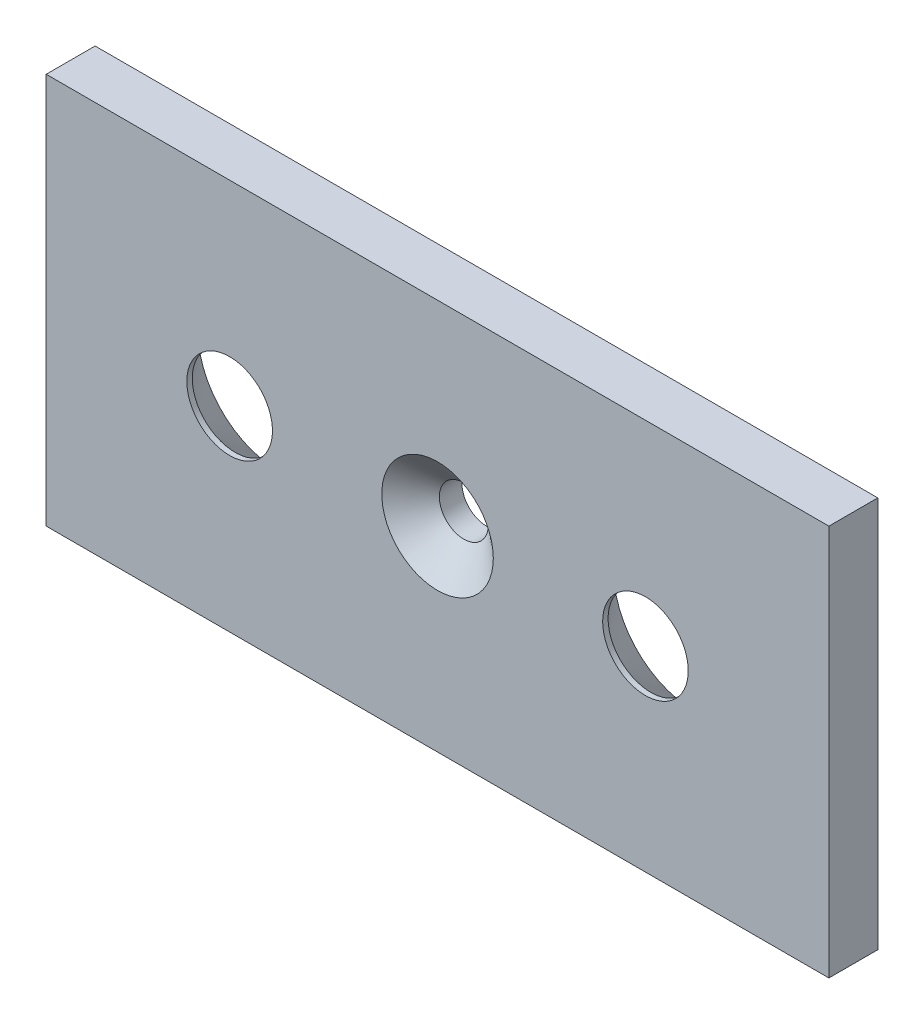
ISO-10303-21;
HEADER;
FILE_DESCRIPTION(('STEP AP214'),'2;1');
FILE_NAME('part.step','',(''),(''),'','','');
FILE_SCHEMA(('AUTOMOTIVE_DESIGN { 1 0 10303 214 1 1 1 1 }'));
ENDSEC;
DATA;
#1=APPLICATION_CONTEXT('core data for automotive mechanical design processes');
#2=APPLICATION_PROTOCOL_DEFINITION('international standard','automotive_design',2000,#1);
#3=PRODUCT_CONTEXT('',#1,'mechanical');
#4=PRODUCT('Part','Part','',(#3));
#5=PRODUCT_RELATED_PRODUCT_CATEGORY('part','',(#4));
#6=PRODUCT_DEFINITION_FORMATION('','',#4);
#7=PRODUCT_DEFINITION_CONTEXT('part definition',#1,'design');
#8=PRODUCT_DEFINITION('design','',#6,#7);
#9=PRODUCT_DEFINITION_SHAPE('','',#8);
#10=(LENGTH_UNIT() NAMED_UNIT(*) SI_UNIT(.MILLI.,.METRE.));
#11=(NAMED_UNIT(*) PLANE_ANGLE_UNIT() SI_UNIT($,.RADIAN.));
#12=(NAMED_UNIT(*) SI_UNIT($,.STERADIAN.) SOLID_ANGLE_UNIT());
#13=UNCERTAINTY_MEASURE_WITH_UNIT(LENGTH_MEASURE(1.E-05),#10,'distance_accuracy_value','');
#14=(GEOMETRIC_REPRESENTATION_CONTEXT(3) GLOBAL_UNCERTAINTY_ASSIGNED_CONTEXT((#13)) GLOBAL_UNIT_ASSIGNED_CONTEXT((#10,
#11,#12)) REPRESENTATION_CONTEXT('',''));
#15=CARTESIAN_POINT('',(0.,0.,0.));
#16=DIRECTION('',(0.,0.,1.));
#17=DIRECTION('',(1.,0.,0.));
#18=AXIS2_PLACEMENT_3D('',#15,#16,#17);
#19=CARTESIAN_POINT('',(0.,0.,3.175));
#20=DIRECTION('',(1.,0.,0.));
#21=DIRECTION('',(0.,0.,-1.));
#22=AXIS2_PLACEMENT_3D('',#19,#20,#21);
#23=PLANE('',#22);
#24=DIRECTION('',(0.,-1.,0.));
#25=VECTOR('',#24,1.);
#26=CARTESIAN_POINT('',(0.,0.,0.));
#27=LINE('',#26,#25);
#28=CARTESIAN_POINT('',(0.,25.4,0.));
#29=VERTEX_POINT('',#28);
#30=CARTESIAN_POINT('',(0.,0.,0.));
#31=VERTEX_POINT('',#30);
#32=EDGE_CURVE('E116',#29,#31,#27,.T.);
#33=ORIENTED_EDGE('',*,*,#32,.T.);
#34=DIRECTION('',(0.,0.,-1.));
#35=VECTOR('',#34,1.);
#36=CARTESIAN_POINT('',(0.,0.,3.175));
#37=LINE('',#36,#35);
#38=CARTESIAN_POINT('',(0.,0.,3.175));
#39=VERTEX_POINT('',#38);
#40=EDGE_CURVE('E11',#39,#31,#37,.T.);
#41=ORIENTED_EDGE('',*,*,#40,.F.);
#42=DIRECTION('',(0.,-1.,0.));
#43=VECTOR('',#42,1.);
#44=CARTESIAN_POINT('',(0.,0.,3.175));
#45=LINE('',#44,#43);
#46=CARTESIAN_POINT('',(0.,25.4,3.175));
#47=VERTEX_POINT('',#46);
#48=EDGE_CURVE('E99',#47,#39,#45,.T.);
#49=ORIENTED_EDGE('',*,*,#48,.F.);
#50=DIRECTION('',(0.,0.,-1.));
#51=VECTOR('',#50,1.);
#52=CARTESIAN_POINT('',(0.,25.4,3.175));
#53=LINE('',#52,#51);
#54=EDGE_CURVE('E112',#47,#29,#53,.T.);
#55=ORIENTED_EDGE('',*,*,#54,.T.);
#56=EDGE_LOOP('',(#33,#41,#49,#55));
#57=FACE_BOUND('',#56,.T.);
#58=ADVANCED_FACE('F45',(#57),#23,.F.);
#59=CARTESIAN_POINT('',(0.,0.,3.175));
#60=DIRECTION('',(0.,1.,0.));
#61=DIRECTION('',(0.,0.,1.));
#62=AXIS2_PLACEMENT_3D('',#59,#60,#61);
#63=PLANE('',#62);
#64=DIRECTION('',(1.,0.,0.));
#65=VECTOR('',#64,1.);
#66=CARTESIAN_POINT('',(0.,0.,0.));
#67=LINE('',#66,#65);
#68=CARTESIAN_POINT('',(50.8,0.,0.));
#69=VERTEX_POINT('',#68);
#70=EDGE_CURVE('E104',#31,#69,#67,.T.);
#71=ORIENTED_EDGE('',*,*,#70,.T.);
#72=DIRECTION('',(0.,0.,-1.));
#73=VECTOR('',#72,1.);
#74=CARTESIAN_POINT('',(50.8,0.,3.175));
#75=LINE('',#74,#73);
#76=CARTESIAN_POINT('',(50.8,0.,3.175));
#77=VERTEX_POINT('',#76);
#78=EDGE_CURVE('E55',#77,#69,#75,.T.);
#79=ORIENTED_EDGE('',*,*,#78,.F.);
#80=DIRECTION('',(1.,0.,0.));
#81=VECTOR('',#80,1.);
#82=CARTESIAN_POINT('',(0.,0.,3.175));
#83=LINE('',#82,#81);
#84=EDGE_CURVE('E94',#39,#77,#83,.T.);
#85=ORIENTED_EDGE('',*,*,#84,.F.);
#86=ORIENTED_EDGE('',*,*,#40,.T.);
#87=EDGE_LOOP('',(#71,#79,#85,#86));
#88=FACE_BOUND('',#87,.T.);
#89=ADVANCED_FACE('F103',(#88),#63,.F.);
#90=CARTESIAN_POINT('',(50.8,0.,3.175));
#91=DIRECTION('',(-1.,0.,0.));
#92=DIRECTION('',(0.,0.,1.));
#93=AXIS2_PLACEMENT_3D('',#90,#91,#92);
#94=PLANE('',#93);
#95=DIRECTION('',(0.,1.,0.));
#96=VECTOR('',#95,1.);
#97=CARTESIAN_POINT('',(50.8,0.,0.));
#98=LINE('',#97,#96);
#99=CARTESIAN_POINT('',(50.8,25.4,0.));
#100=VERTEX_POINT('',#99);
#101=EDGE_CURVE('E81',#69,#100,#98,.T.);
#102=ORIENTED_EDGE('',*,*,#101,.T.);
#103=DIRECTION('',(0.,0.,-1.));
#104=VECTOR('',#103,1.);
#105=CARTESIAN_POINT('',(50.8,25.4,3.175));
#106=LINE('',#105,#104);
#107=CARTESIAN_POINT('',(50.8,25.4,3.175));
#108=VERTEX_POINT('',#107);
#109=EDGE_CURVE('E106',#108,#100,#106,.T.);
#110=ORIENTED_EDGE('',*,*,#109,.F.);
#111=DIRECTION('',(0.,1.,0.));
#112=VECTOR('',#111,1.);
#113=CARTESIAN_POINT('',(50.8,0.,3.175));
#114=LINE('',#113,#112);
#115=EDGE_CURVE('E97',#77,#108,#114,.T.);
#116=ORIENTED_EDGE('',*,*,#115,.F.);
#117=ORIENTED_EDGE('',*,*,#78,.T.);
#118=EDGE_LOOP('',(#102,#110,#116,#117));
#119=FACE_BOUND('',#118,.T.);
#120=ADVANCED_FACE('F108',(#119),#94,.F.);
#121=CARTESIAN_POINT('',(0.,25.4,3.175));
#122=DIRECTION('',(0.,-1.,0.));
#123=DIRECTION('',(0.,0.,-1.));
#124=AXIS2_PLACEMENT_3D('',#121,#122,#123);
#125=PLANE('',#124);
#126=DIRECTION('',(-1.,0.,0.));
#127=VECTOR('',#126,1.);
#128=CARTESIAN_POINT('',(0.,25.4,0.));
#129=LINE('',#128,#127);
#130=EDGE_CURVE('E87',#100,#29,#129,.T.);
#131=ORIENTED_EDGE('',*,*,#130,.T.);
#132=ORIENTED_EDGE('',*,*,#54,.F.);
#133=DIRECTION('',(-1.,0.,0.));
#134=VECTOR('',#133,1.);
#135=CARTESIAN_POINT('',(0.,25.4,3.175));
#136=LINE('',#135,#134);
#137=EDGE_CURVE('E64',#108,#47,#136,.T.);
#138=ORIENTED_EDGE('',*,*,#137,.F.);
#139=ORIENTED_EDGE('',*,*,#109,.T.);
#140=EDGE_LOOP('',(#131,#132,#138,#139));
#141=FACE_BOUND('',#140,.T.);
#142=ADVANCED_FACE('F171',(#141),#125,.F.);
#143=CARTESIAN_POINT('',(0.,0.,3.175));
#144=DIRECTION('',(0.,0.,-1.));
#145=DIRECTION('',(-1.,0.,0.));
#146=AXIS2_PLACEMENT_3D('',#143,#144,#145);
#147=PLANE('',#146);
#148=CARTESIAN_POINT('',(38.89375,12.7,3.175));
#149=DIRECTION('',(0.,0.,-1.));
#150=DIRECTION('',(-1.,0.,0.));
#151=AXIS2_PLACEMENT_3D('',#148,#149,#150);
#152=CIRCLE('',#151,2.778125);
#153=CARTESIAN_POINT('',(36.115625,12.7,3.175));
#154=VERTEX_POINT('',#153);
#155=EDGE_CURVE('E48',#154,#154,#152,.T.);
#156=ORIENTED_EDGE('',*,*,#155,.T.);
#157=EDGE_LOOP('',(#156));
#158=FACE_BOUND('',#157,.T.);
#159=CARTESIAN_POINT('',(11.90625,12.7,3.175));
#160=DIRECTION('',(0.,0.,-1.));
#161=DIRECTION('',(-1.,0.,0.));
#162=AXIS2_PLACEMENT_3D('',#159,#160,#161);
#163=CIRCLE('',#162,2.77812499999999);
#164=CARTESIAN_POINT('',(9.12812500000001,12.7,3.175));
#165=VERTEX_POINT('',#164);
#166=EDGE_CURVE('E134',#165,#165,#163,.T.);
#167=ORIENTED_EDGE('',*,*,#166,.T.);
#168=EDGE_LOOP('',(#167));
#169=FACE_BOUND('',#168,.T.);
#170=CARTESIAN_POINT('',(25.4,12.7,3.175));
#171=DIRECTION('',(0.,0.,1.));
#172=DIRECTION('',(1.,0.,0.));
#173=AXIS2_PLACEMENT_3D('',#170,#171,#172);
#174=CIRCLE('',#173,3.6195);
#175=CARTESIAN_POINT('',(29.0195,12.7,3.175));
#176=VERTEX_POINT('',#175);
#177=EDGE_CURVE('E137',#176,#176,#174,.T.);
#178=ORIENTED_EDGE('',*,*,#177,.F.);
#179=EDGE_LOOP('',(#178));
#180=FACE_BOUND('',#179,.T.);
#181=ORIENTED_EDGE('',*,*,#48,.T.);
#182=ORIENTED_EDGE('',*,*,#84,.T.);
#183=ORIENTED_EDGE('',*,*,#115,.T.);
#184=ORIENTED_EDGE('',*,*,#137,.T.);
#185=EDGE_LOOP('',(#181,#182,#183,#184));
#186=FACE_BOUND('',#185,.T.);
#187=ADVANCED_FACE('F95',(#158,#169,#180,#186),#147,.F.);
#188=CARTESIAN_POINT('',(0.,0.,0.));
#189=DIRECTION('',(0.,0.,-1.));
#190=DIRECTION('',(-1.,0.,0.));
#191=AXIS2_PLACEMENT_3D('',#188,#189,#190);
#192=PLANE('',#191);
#193=CARTESIAN_POINT('',(38.89375,12.7,0.));
#194=DIRECTION('',(0.,0.,-1.));
#195=DIRECTION('',(-1.,0.,0.));
#196=AXIS2_PLACEMENT_3D('',#193,#194,#195);
#197=CIRCLE('',#196,5.2324);
#198=CARTESIAN_POINT('',(33.66135,12.7,0.));
#199=VERTEX_POINT('',#198);
#200=EDGE_CURVE('E262',#199,#199,#197,.T.);
#201=ORIENTED_EDGE('',*,*,#200,.F.);
#202=EDGE_LOOP('',(#201));
#203=FACE_BOUND('',#202,.T.);
#204=CARTESIAN_POINT('',(11.90625,12.7,0.));
#205=DIRECTION('',(0.,0.,-1.));
#206=DIRECTION('',(-1.,0.,0.));
#207=AXIS2_PLACEMENT_3D('',#204,#205,#206);
#208=CIRCLE('',#207,5.2324);
#209=CARTESIAN_POINT('',(6.67385,12.7,0.));
#210=VERTEX_POINT('',#209);
#211=EDGE_CURVE('E146',#210,#210,#208,.T.);
#212=ORIENTED_EDGE('',*,*,#211,.F.);
#213=EDGE_LOOP('',(#212));
#214=FACE_BOUND('',#213,.T.);
#215=CARTESIAN_POINT('',(25.4,12.7,0.));
#216=DIRECTION('',(0.,0.,-1.));
#217=DIRECTION('',(-1.,0.,0.));
#218=AXIS2_PLACEMENT_3D('',#215,#216,#217);
#219=CIRCLE('',#218,1.5875);
#220=CARTESIAN_POINT('',(23.8125,12.7,0.));
#221=VERTEX_POINT('',#220);
#222=EDGE_CURVE('E120',#221,#221,#219,.T.);
#223=ORIENTED_EDGE('',*,*,#222,.F.);
#224=EDGE_LOOP('',(#223));
#225=FACE_BOUND('',#224,.T.);
#226=ORIENTED_EDGE('',*,*,#32,.F.);
#227=ORIENTED_EDGE('',*,*,#130,.F.);
#228=ORIENTED_EDGE('',*,*,#101,.F.);
#229=ORIENTED_EDGE('',*,*,#70,.F.);
#230=EDGE_LOOP('',(#226,#227,#228,#229));
#231=FACE_BOUND('',#230,.T.);
#232=ADVANCED_FACE('F170',(#203,#214,#225,#231),#192,.T.);
#233=CARTESIAN_POINT('',(25.4,12.7,3.175));
#234=DIRECTION('',(0.,0.,1.));
#235=DIRECTION('',(1.,0.,0.));
#236=AXIS2_PLACEMENT_3D('',#233,#234,#235);
#237=CYLINDRICAL_SURFACE('',#236,1.5875);
#238=ORIENTED_EDGE('',*,*,#222,.T.);
#239=EDGE_LOOP('',(#238));
#240=FACE_BOUND('',#239,.T.);
#241=CARTESIAN_POINT('',(25.4,12.7,1.46994954944777));
#242=DIRECTION('',(0.,0.,1.));
#243=DIRECTION('',(1.,0.,0.));
#244=AXIS2_PLACEMENT_3D('',#241,#242,#243);
#245=CIRCLE('',#244,1.5875);
#246=CARTESIAN_POINT('',(26.9875,12.7,1.46994954944777));
#247=VERTEX_POINT('',#246);
#248=EDGE_CURVE('E133',#247,#247,#245,.T.);
#249=ORIENTED_EDGE('',*,*,#248,.T.);
#250=EDGE_LOOP('',(#249));
#251=FACE_BOUND('',#250,.T.);
#252=ADVANCED_FACE('F160',(#240,#251),#237,.F.);
#253=CARTESIAN_POINT('',(25.4,12.7,3.175));
#254=DIRECTION('',(0.,0.,1.));
#255=DIRECTION('',(1.,0.,0.));
#256=AXIS2_PLACEMENT_3D('',#253,#254,#255);
#257=CONICAL_SURFACE('',#256,3.6195,0.872664625997166);
#258=ORIENTED_EDGE('',*,*,#248,.F.);
#259=EDGE_LOOP('',(#258));
#260=FACE_BOUND('',#259,.T.);
#261=ORIENTED_EDGE('',*,*,#177,.T.);
#262=EDGE_LOOP('',(#261));
#263=FACE_BOUND('',#262,.T.);
#264=ADVANCED_FACE('F162',(#260,#263),#257,.F.);
#265=CARTESIAN_POINT('',(11.90625,12.7,0.));
#266=DIRECTION('',(0.,0.,-1.));
#267=DIRECTION('',(-1.,0.,0.));
#268=AXIS2_PLACEMENT_3D('',#265,#266,#267);
#269=CYLINDRICAL_SURFACE('',#268,2.77812499999999);
#270=CARTESIAN_POINT('',(11.90625,12.7,2.82332042263234));
#271=DIRECTION('',(0.,0.,-1.));
#272=DIRECTION('',(-1.,0.,0.));
#273=AXIS2_PLACEMENT_3D('',#270,#271,#272);
#274=CIRCLE('',#273,2.778125);
#275=CARTESIAN_POINT('',(9.12812500000001,12.7,2.82332042263234));
#276=VERTEX_POINT('',#275);
#277=EDGE_CURVE('E138',#276,#276,#274,.T.);
#278=ORIENTED_EDGE('',*,*,#277,.T.);
#279=EDGE_LOOP('',(#278));
#280=FACE_BOUND('',#279,.T.);
#281=ORIENTED_EDGE('',*,*,#166,.F.);
#282=EDGE_LOOP('',(#281));
#283=FACE_BOUND('',#282,.T.);
#284=ADVANCED_FACE('F165',(#280,#283),#269,.F.);
#285=CARTESIAN_POINT('',(11.90625,12.7,0.));
#286=DIRECTION('',(0.,0.,-1.));
#287=DIRECTION('',(-1.,0.,0.));
#288=AXIS2_PLACEMENT_3D('',#285,#286,#287);
#289=CONICAL_SURFACE('',#288,5.2324,0.715584993317676);
#290=ORIENTED_EDGE('',*,*,#277,.F.);
#291=EDGE_LOOP('',(#290));
#292=FACE_BOUND('',#291,.T.);
#293=ORIENTED_EDGE('',*,*,#211,.T.);
#294=EDGE_LOOP('',(#293));
#295=FACE_BOUND('',#294,.T.);
#296=ADVANCED_FACE('F224',(#292,#295),#289,.F.);
#297=CARTESIAN_POINT('',(38.89375,12.7,0.));
#298=DIRECTION('',(0.,0.,-1.));
#299=DIRECTION('',(-1.,0.,0.));
#300=AXIS2_PLACEMENT_3D('',#297,#298,#299);
#301=CYLINDRICAL_SURFACE('',#300,2.778125);
#302=CARTESIAN_POINT('',(38.89375,12.7,2.82332042263234));
#303=DIRECTION('',(0.,0.,-1.));
#304=DIRECTION('',(-1.,0.,0.));
#305=AXIS2_PLACEMENT_3D('',#302,#303,#304);
#306=CIRCLE('',#305,2.778125);
#307=CARTESIAN_POINT('',(36.115625,12.7,2.82332042263234));
#308=VERTEX_POINT('',#307);
#309=EDGE_CURVE('E259',#308,#308,#306,.T.);
#310=ORIENTED_EDGE('',*,*,#309,.T.);
#311=EDGE_LOOP('',(#310));
#312=FACE_BOUND('',#311,.T.);
#313=ORIENTED_EDGE('',*,*,#155,.F.);
#314=EDGE_LOOP('',(#313));
#315=FACE_BOUND('',#314,.T.);
#316=ADVANCED_FACE('F233',(#312,#315),#301,.F.);
#317=CARTESIAN_POINT('',(38.89375,12.7,0.));
#318=DIRECTION('',(0.,0.,-1.));
#319=DIRECTION('',(-1.,0.,0.));
#320=AXIS2_PLACEMENT_3D('',#317,#318,#319);
#321=CONICAL_SURFACE('',#320,5.2324,0.715584993317675);
#322=ORIENTED_EDGE('',*,*,#309,.F.);
#323=EDGE_LOOP('',(#322));
#324=FACE_BOUND('',#323,.T.);
#325=ORIENTED_EDGE('',*,*,#200,.T.);
#326=EDGE_LOOP('',(#325));
#327=FACE_BOUND('',#326,.T.);
#328=ADVANCED_FACE('F243',(#324,#327),#321,.F.);
#329=CLOSED_SHELL('',(#58,#89,#120,#142,#187,#232,#252,#264,#284,#296,#316,#328));
#330=MANIFOLD_SOLID_BREP('B2',#329);
#331=ADVANCED_BREP_SHAPE_REPRESENTATION('',(#18,#330),#14);
#332=SHAPE_DEFINITION_REPRESENTATION(#9,#331);
ENDSEC;
END-ISO-10303-21;
